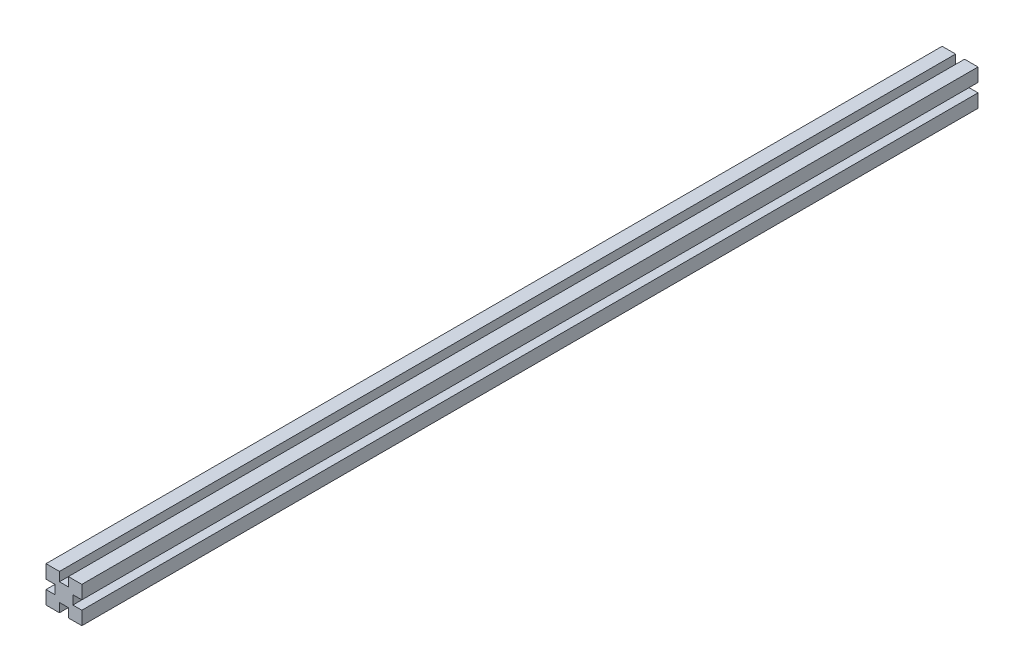
ISO-10303-21;
HEADER;
FILE_DESCRIPTION(('STEP AP214'),'2;1');
FILE_NAME('part.step','',(''),(''),'','','');
FILE_SCHEMA(('AUTOMOTIVE_DESIGN { 1 0 10303 214 1 1 1 1 }'));
ENDSEC;
DATA;
#1=APPLICATION_CONTEXT('core data for automotive mechanical design processes');
#2=APPLICATION_PROTOCOL_DEFINITION('international standard','automotive_design',2000,#1);
#3=PRODUCT_CONTEXT('',#1,'mechanical');
#4=PRODUCT('Part','Part','',(#3));
#5=PRODUCT_RELATED_PRODUCT_CATEGORY('part','',(#4));
#6=PRODUCT_DEFINITION_FORMATION('','',#4);
#7=PRODUCT_DEFINITION_CONTEXT('part definition',#1,'design');
#8=PRODUCT_DEFINITION('design','',#6,#7);
#9=PRODUCT_DEFINITION_SHAPE('','',#8);
#10=(LENGTH_UNIT() NAMED_UNIT(*) SI_UNIT(.MILLI.,.METRE.));
#11=(NAMED_UNIT(*) PLANE_ANGLE_UNIT() SI_UNIT($,.RADIAN.));
#12=(NAMED_UNIT(*) SI_UNIT($,.STERADIAN.) SOLID_ANGLE_UNIT());
#13=UNCERTAINTY_MEASURE_WITH_UNIT(LENGTH_MEASURE(1.E-05),#10,'distance_accuracy_value','');
#14=(GEOMETRIC_REPRESENTATION_CONTEXT(3) GLOBAL_UNCERTAINTY_ASSIGNED_CONTEXT((#13)) GLOBAL_UNIT_ASSIGNED_CONTEXT((#10,
#11,#12)) REPRESENTATION_CONTEXT('',''));
#15=CARTESIAN_POINT('',(0.,0.,0.));
#16=DIRECTION('',(0.,0.,1.));
#17=DIRECTION('',(1.,0.,0.));
#18=AXIS2_PLACEMENT_3D('',#15,#16,#17);
#19=CARTESIAN_POINT('',(10.,2.49999999999997,500.));
#20=DIRECTION('',(-1.,0.,0.));
#21=DIRECTION('',(0.,-1.,0.));
#22=AXIS2_PLACEMENT_3D('',#19,#20,#21);
#23=PLANE('',#22);
#24=DIRECTION('',(0.,1.,0.));
#25=VECTOR('',#24,1.);
#26=CARTESIAN_POINT('',(10.,2.49999999999997,0.));
#27=LINE('',#26,#25);
#28=CARTESIAN_POINT('',(10.,2.49999999999997,0.));
#29=VERTEX_POINT('',#28);
#30=CARTESIAN_POINT('',(10.,10.,0.));
#31=VERTEX_POINT('',#30);
#32=EDGE_CURVE('E203',#29,#31,#27,.T.);
#33=ORIENTED_EDGE('',*,*,#32,.T.);
#34=DIRECTION('',(0.,0.,-1.));
#35=VECTOR('',#34,1.);
#36=CARTESIAN_POINT('',(10.,10.,500.));
#37=LINE('',#36,#35);
#38=CARTESIAN_POINT('',(10.,10.,500.));
#39=VERTEX_POINT('',#38);
#40=EDGE_CURVE('E11',#39,#31,#37,.T.);
#41=ORIENTED_EDGE('',*,*,#40,.F.);
#42=DIRECTION('',(0.,1.,0.));
#43=VECTOR('',#42,1.);
#44=CARTESIAN_POINT('',(10.,2.49999999999997,500.));
#45=LINE('',#44,#43);
#46=CARTESIAN_POINT('',(10.,2.49999999999997,500.));
#47=VERTEX_POINT('',#46);
#48=EDGE_CURVE('E241',#47,#39,#45,.T.);
#49=ORIENTED_EDGE('',*,*,#48,.F.);
#50=DIRECTION('',(0.,0.,-1.));
#51=VECTOR('',#50,1.);
#52=CARTESIAN_POINT('',(10.,2.49999999999997,500.));
#53=LINE('',#52,#51);
#54=EDGE_CURVE('E199',#47,#29,#53,.T.);
#55=ORIENTED_EDGE('',*,*,#54,.T.);
#56=EDGE_LOOP('',(#33,#41,#49,#55));
#57=FACE_BOUND('',#56,.T.);
#58=ADVANCED_FACE('F35',(#57),#23,.F.);
#59=CARTESIAN_POINT('',(2.5,10.,500.));
#60=DIRECTION('',(0.,-1.,0.));
#61=DIRECTION('',(0.,0.,-1.));
#62=AXIS2_PLACEMENT_3D('',#59,#60,#61);
#63=PLANE('',#62);
#64=DIRECTION('',(-1.,0.,0.));
#65=VECTOR('',#64,1.);
#66=CARTESIAN_POINT('',(2.5,10.,0.));
#67=LINE('',#66,#65);
#68=CARTESIAN_POINT('',(2.5,10.,0.));
#69=VERTEX_POINT('',#68);
#70=EDGE_CURVE('E206',#31,#69,#67,.T.);
#71=ORIENTED_EDGE('',*,*,#70,.T.);
#72=DIRECTION('',(0.,0.,-1.));
#73=VECTOR('',#72,1.);
#74=CARTESIAN_POINT('',(2.5,10.,500.));
#75=LINE('',#74,#73);
#76=CARTESIAN_POINT('',(2.5,10.,500.));
#77=VERTEX_POINT('',#76);
#78=EDGE_CURVE('E43',#77,#69,#75,.T.);
#79=ORIENTED_EDGE('',*,*,#78,.F.);
#80=DIRECTION('',(-1.,0.,0.));
#81=VECTOR('',#80,1.);
#82=CARTESIAN_POINT('',(2.5,10.,500.));
#83=LINE('',#82,#81);
#84=EDGE_CURVE('E130',#39,#77,#83,.T.);
#85=ORIENTED_EDGE('',*,*,#84,.F.);
#86=ORIENTED_EDGE('',*,*,#40,.T.);
#87=EDGE_LOOP('',(#71,#79,#85,#86));
#88=FACE_BOUND('',#87,.T.);
#89=ADVANCED_FACE('F359',(#88),#63,.F.);
#90=CARTESIAN_POINT('',(2.5,10.,500.));
#91=DIRECTION('',(1.,0.,0.));
#92=DIRECTION('',(0.,1.,0.));
#93=AXIS2_PLACEMENT_3D('',#90,#91,#92);
#94=PLANE('',#93);
#95=DIRECTION('',(0.,-1.,0.));
#96=VECTOR('',#95,1.);
#97=CARTESIAN_POINT('',(2.5,10.,0.));
#98=LINE('',#97,#96);
#99=CARTESIAN_POINT('',(2.5,5.,0.));
#100=VERTEX_POINT('',#99);
#101=EDGE_CURVE('E208',#69,#100,#98,.T.);
#102=ORIENTED_EDGE('',*,*,#101,.T.);
#103=DIRECTION('',(0.,0.,-1.));
#104=VECTOR('',#103,1.);
#105=CARTESIAN_POINT('',(2.5,5.,500.));
#106=LINE('',#105,#104);
#107=CARTESIAN_POINT('',(2.5,5.,500.));
#108=VERTEX_POINT('',#107);
#109=EDGE_CURVE('E284',#108,#100,#106,.T.);
#110=ORIENTED_EDGE('',*,*,#109,.F.);
#111=DIRECTION('',(0.,-1.,0.));
#112=VECTOR('',#111,1.);
#113=CARTESIAN_POINT('',(2.5,10.,500.));
#114=LINE('',#113,#112);
#115=EDGE_CURVE('E292',#77,#108,#114,.T.);
#116=ORIENTED_EDGE('',*,*,#115,.F.);
#117=ORIENTED_EDGE('',*,*,#78,.T.);
#118=EDGE_LOOP('',(#102,#110,#116,#117));
#119=FACE_BOUND('',#118,.T.);
#120=ADVANCED_FACE('F290',(#119),#94,.F.);
#121=CARTESIAN_POINT('',(2.5,5.,500.));
#122=DIRECTION('',(0.,-1.,0.));
#123=DIRECTION('',(1.,0.,0.));
#124=AXIS2_PLACEMENT_3D('',#121,#122,#123);
#125=PLANE('',#124);
#126=DIRECTION('',(-1.,0.,0.));
#127=VECTOR('',#126,1.);
#128=CARTESIAN_POINT('',(2.5,5.,0.));
#129=LINE('',#128,#127);
#130=CARTESIAN_POINT('',(-2.5,5.,0.));
#131=VERTEX_POINT('',#130);
#132=EDGE_CURVE('E210',#100,#131,#129,.T.);
#133=ORIENTED_EDGE('',*,*,#132,.T.);
#134=DIRECTION('',(0.,0.,-1.));
#135=VECTOR('',#134,1.);
#136=CARTESIAN_POINT('',(-2.5,5.,500.));
#137=LINE('',#136,#135);
#138=CARTESIAN_POINT('',(-2.5,5.,500.));
#139=VERTEX_POINT('',#138);
#140=EDGE_CURVE('E281',#139,#131,#137,.T.);
#141=ORIENTED_EDGE('',*,*,#140,.F.);
#142=DIRECTION('',(-1.,0.,0.));
#143=VECTOR('',#142,1.);
#144=CARTESIAN_POINT('',(2.5,5.,500.));
#145=LINE('',#144,#143);
#146=EDGE_CURVE('E310',#108,#139,#145,.T.);
#147=ORIENTED_EDGE('',*,*,#146,.F.);
#148=ORIENTED_EDGE('',*,*,#109,.T.);
#149=EDGE_LOOP('',(#133,#141,#147,#148));
#150=FACE_BOUND('',#149,.T.);
#151=ADVANCED_FACE('F301',(#150),#125,.F.);
#152=CARTESIAN_POINT('',(-2.5,5.,500.));
#153=DIRECTION('',(-1.,0.,0.));
#154=DIRECTION('',(0.,0.,1.));
#155=AXIS2_PLACEMENT_3D('',#152,#153,#154);
#156=PLANE('',#155);
#157=DIRECTION('',(0.,1.,0.));
#158=VECTOR('',#157,1.);
#159=CARTESIAN_POINT('',(-2.5,5.,0.));
#160=LINE('',#159,#158);
#161=CARTESIAN_POINT('',(-2.5,10.,0.));
#162=VERTEX_POINT('',#161);
#163=EDGE_CURVE('E212',#131,#162,#160,.T.);
#164=ORIENTED_EDGE('',*,*,#163,.T.);
#165=DIRECTION('',(0.,0.,-1.));
#166=VECTOR('',#165,1.);
#167=CARTESIAN_POINT('',(-2.5,10.,500.));
#168=LINE('',#167,#166);
#169=CARTESIAN_POINT('',(-2.5,10.,500.));
#170=VERTEX_POINT('',#169);
#171=EDGE_CURVE('E278',#170,#162,#168,.T.);
#172=ORIENTED_EDGE('',*,*,#171,.F.);
#173=DIRECTION('',(0.,1.,0.));
#174=VECTOR('',#173,1.);
#175=CARTESIAN_POINT('',(-2.5,5.,500.));
#176=LINE('',#175,#174);
#177=EDGE_CURVE('E307',#139,#170,#176,.T.);
#178=ORIENTED_EDGE('',*,*,#177,.F.);
#179=ORIENTED_EDGE('',*,*,#140,.T.);
#180=EDGE_LOOP('',(#164,#172,#178,#179));
#181=FACE_BOUND('',#180,.T.);
#182=ADVANCED_FACE('F305',(#181),#156,.F.);
#183=CARTESIAN_POINT('',(-10.,10.,500.));
#184=DIRECTION('',(0.,-1.,0.));
#185=DIRECTION('',(0.,0.,-1.));
#186=AXIS2_PLACEMENT_3D('',#183,#184,#185);
#187=PLANE('',#186);
#188=DIRECTION('',(-1.,0.,0.));
#189=VECTOR('',#188,1.);
#190=CARTESIAN_POINT('',(-10.,10.,0.));
#191=LINE('',#190,#189);
#192=CARTESIAN_POINT('',(-10.,10.,0.));
#193=VERTEX_POINT('',#192);
#194=EDGE_CURVE('E214',#162,#193,#191,.T.);
#195=ORIENTED_EDGE('',*,*,#194,.T.);
#196=DIRECTION('',(0.,0.,-1.));
#197=VECTOR('',#196,1.);
#198=CARTESIAN_POINT('',(-10.,10.,500.));
#199=LINE('',#198,#197);
#200=CARTESIAN_POINT('',(-10.,10.,500.));
#201=VERTEX_POINT('',#200);
#202=EDGE_CURVE('E275',#201,#193,#199,.T.);
#203=ORIENTED_EDGE('',*,*,#202,.F.);
#204=DIRECTION('',(-1.,0.,0.));
#205=VECTOR('',#204,1.);
#206=CARTESIAN_POINT('',(-10.,10.,500.));
#207=LINE('',#206,#205);
#208=EDGE_CURVE('E309',#170,#201,#207,.T.);
#209=ORIENTED_EDGE('',*,*,#208,.F.);
#210=ORIENTED_EDGE('',*,*,#171,.T.);
#211=EDGE_LOOP('',(#195,#203,#209,#210));
#212=FACE_BOUND('',#211,.T.);
#213=ADVANCED_FACE('F372',(#212),#187,.F.);
#214=CARTESIAN_POINT('',(-9.99999999999997,2.5000000000001,500.));
#215=DIRECTION('',(1.,0.,0.));
#216=DIRECTION('',(0.,1.,0.));
#217=AXIS2_PLACEMENT_3D('',#214,#215,#216);
#218=PLANE('',#217);
#219=DIRECTION('',(0.,-1.,0.));
#220=VECTOR('',#219,1.);
#221=CARTESIAN_POINT('',(-9.99999999999997,2.5000000000001,0.));
#222=LINE('',#221,#220);
#223=CARTESIAN_POINT('',(-9.99999999999997,2.5000000000001,0.));
#224=VERTEX_POINT('',#223);
#225=EDGE_CURVE('E216',#193,#224,#222,.T.);
#226=ORIENTED_EDGE('',*,*,#225,.T.);
#227=DIRECTION('',(0.,0.,-1.));
#228=VECTOR('',#227,1.);
#229=CARTESIAN_POINT('',(-9.99999999999997,2.5000000000001,500.));
#230=LINE('',#229,#228);
#231=CARTESIAN_POINT('',(-9.99999999999997,2.5000000000001,500.));
#232=VERTEX_POINT('',#231);
#233=EDGE_CURVE('E272',#232,#224,#230,.T.);
#234=ORIENTED_EDGE('',*,*,#233,.F.);
#235=DIRECTION('',(0.,-1.,0.));
#236=VECTOR('',#235,1.);
#237=CARTESIAN_POINT('',(-9.99999999999997,2.5000000000001,500.));
#238=LINE('',#237,#236);
#239=EDGE_CURVE('E312',#201,#232,#238,.T.);
#240=ORIENTED_EDGE('',*,*,#239,.F.);
#241=ORIENTED_EDGE('',*,*,#202,.T.);
#242=EDGE_LOOP('',(#226,#234,#240,#241));
#243=FACE_BOUND('',#242,.T.);
#244=ADVANCED_FACE('F375',(#243),#218,.F.);
#245=CARTESIAN_POINT('',(-9.99999999999997,2.5000000000001,500.));
#246=DIRECTION('',(0.,1.,0.));
#247=DIRECTION('',(-1.,0.,0.));
#248=AXIS2_PLACEMENT_3D('',#245,#246,#247);
#249=PLANE('',#248);
#250=DIRECTION('',(1.,0.,0.));
#251=VECTOR('',#250,1.);
#252=CARTESIAN_POINT('',(-9.99999999999997,2.5000000000001,0.));
#253=LINE('',#252,#251);
#254=CARTESIAN_POINT('',(-4.99999999999997,2.50000000000005,0.));
#255=VERTEX_POINT('',#254);
#256=EDGE_CURVE('E218',#224,#255,#253,.T.);
#257=ORIENTED_EDGE('',*,*,#256,.T.);
#258=DIRECTION('',(0.,0.,-1.));
#259=VECTOR('',#258,1.);
#260=CARTESIAN_POINT('',(-4.99999999999997,2.50000000000005,500.));
#261=LINE('',#260,#259);
#262=CARTESIAN_POINT('',(-4.99999999999997,2.50000000000005,500.));
#263=VERTEX_POINT('',#262);
#264=EDGE_CURVE('E269',#263,#255,#261,.T.);
#265=ORIENTED_EDGE('',*,*,#264,.F.);
#266=DIRECTION('',(1.,0.,0.));
#267=VECTOR('',#266,1.);
#268=CARTESIAN_POINT('',(-9.99999999999997,2.5000000000001,500.));
#269=LINE('',#268,#267);
#270=EDGE_CURVE('E318',#232,#263,#269,.T.);
#271=ORIENTED_EDGE('',*,*,#270,.F.);
#272=ORIENTED_EDGE('',*,*,#233,.T.);
#273=EDGE_LOOP('',(#257,#265,#271,#272));
#274=FACE_BOUND('',#273,.T.);
#275=ADVANCED_FACE('F379',(#274),#249,.F.);
#276=CARTESIAN_POINT('',(-4.99999999999997,2.50000000000005,500.));
#277=DIRECTION('',(1.,0.,0.));
#278=DIRECTION('',(0.,1.,0.));
#279=AXIS2_PLACEMENT_3D('',#276,#277,#278);
#280=PLANE('',#279);
#281=DIRECTION('',(0.,-1.,0.));
#282=VECTOR('',#281,1.);
#283=CARTESIAN_POINT('',(-4.99999999999997,2.50000000000005,0.));
#284=LINE('',#283,#282);
#285=CARTESIAN_POINT('',(-5.00000000000002,-2.49999999999995,0.));
#286=VERTEX_POINT('',#285);
#287=EDGE_CURVE('E220',#255,#286,#284,.T.);
#288=ORIENTED_EDGE('',*,*,#287,.T.);
#289=DIRECTION('',(0.,0.,-1.));
#290=VECTOR('',#289,1.);
#291=CARTESIAN_POINT('',(-5.00000000000002,-2.49999999999995,500.));
#292=LINE('',#291,#290);
#293=CARTESIAN_POINT('',(-5.00000000000002,-2.49999999999995,500.));
#294=VERTEX_POINT('',#293);
#295=EDGE_CURVE('E266',#294,#286,#292,.T.);
#296=ORIENTED_EDGE('',*,*,#295,.F.);
#297=DIRECTION('',(0.,-1.,0.));
#298=VECTOR('',#297,1.);
#299=CARTESIAN_POINT('',(-4.99999999999997,2.50000000000005,500.));
#300=LINE('',#299,#298);
#301=EDGE_CURVE('E320',#263,#294,#300,.T.);
#302=ORIENTED_EDGE('',*,*,#301,.F.);
#303=ORIENTED_EDGE('',*,*,#264,.T.);
#304=EDGE_LOOP('',(#288,#296,#302,#303));
#305=FACE_BOUND('',#304,.T.);
#306=ADVANCED_FACE('F383',(#305),#280,.F.);
#307=CARTESIAN_POINT('',(-5.00000000000002,-2.49999999999995,500.));
#308=DIRECTION('',(0.,-1.,0.));
#309=DIRECTION('',(1.,0.,0.));
#310=AXIS2_PLACEMENT_3D('',#307,#308,#309);
#311=PLANE('',#310);
#312=DIRECTION('',(-1.,0.,0.));
#313=VECTOR('',#312,1.);
#314=CARTESIAN_POINT('',(-5.00000000000002,-2.49999999999995,0.));
#315=LINE('',#314,#313);
#316=CARTESIAN_POINT('',(-10.,-2.4999999999999,0.));
#317=VERTEX_POINT('',#316);
#318=EDGE_CURVE('E222',#286,#317,#315,.T.);
#319=ORIENTED_EDGE('',*,*,#318,.T.);
#320=DIRECTION('',(0.,0.,-1.));
#321=VECTOR('',#320,1.);
#322=CARTESIAN_POINT('',(-10.,-2.4999999999999,500.));
#323=LINE('',#322,#321);
#324=CARTESIAN_POINT('',(-10.,-2.4999999999999,500.));
#325=VERTEX_POINT('',#324);
#326=EDGE_CURVE('E263',#325,#317,#323,.T.);
#327=ORIENTED_EDGE('',*,*,#326,.F.);
#328=DIRECTION('',(-1.,0.,0.));
#329=VECTOR('',#328,1.);
#330=CARTESIAN_POINT('',(-5.00000000000002,-2.49999999999995,500.));
#331=LINE('',#330,#329);
#332=EDGE_CURVE('E322',#294,#325,#331,.T.);
#333=ORIENTED_EDGE('',*,*,#332,.F.);
#334=ORIENTED_EDGE('',*,*,#295,.T.);
#335=EDGE_LOOP('',(#319,#327,#333,#334));
#336=FACE_BOUND('',#335,.T.);
#337=ADVANCED_FACE('F387',(#336),#311,.F.);
#338=CARTESIAN_POINT('',(-10.,-10.,500.));
#339=DIRECTION('',(1.,0.,0.));
#340=DIRECTION('',(0.,1.,0.));
#341=AXIS2_PLACEMENT_3D('',#338,#339,#340);
#342=PLANE('',#341);
#343=DIRECTION('',(0.,-1.,0.));
#344=VECTOR('',#343,1.);
#345=CARTESIAN_POINT('',(-10.,-10.,0.));
#346=LINE('',#345,#344);
#347=CARTESIAN_POINT('',(-10.,-10.,0.));
#348=VERTEX_POINT('',#347);
#349=EDGE_CURVE('E224',#317,#348,#346,.T.);
#350=ORIENTED_EDGE('',*,*,#349,.T.);
#351=DIRECTION('',(0.,0.,-1.));
#352=VECTOR('',#351,1.);
#353=CARTESIAN_POINT('',(-10.,-10.,500.));
#354=LINE('',#353,#352);
#355=CARTESIAN_POINT('',(-10.,-10.,500.));
#356=VERTEX_POINT('',#355);
#357=EDGE_CURVE('E260',#356,#348,#354,.T.);
#358=ORIENTED_EDGE('',*,*,#357,.F.);
#359=DIRECTION('',(0.,-1.,0.));
#360=VECTOR('',#359,1.);
#361=CARTESIAN_POINT('',(-10.,-10.,500.));
#362=LINE('',#361,#360);
#363=EDGE_CURVE('E324',#325,#356,#362,.T.);
#364=ORIENTED_EDGE('',*,*,#363,.F.);
#365=ORIENTED_EDGE('',*,*,#326,.T.);
#366=EDGE_LOOP('',(#350,#358,#364,#365));
#367=FACE_BOUND('',#366,.T.);
#368=ADVANCED_FACE('F391',(#367),#342,.F.);
#369=CARTESIAN_POINT('',(-10.,-10.,500.));
#370=DIRECTION('',(0.,1.,0.));
#371=DIRECTION('',(-1.,0.,0.));
#372=AXIS2_PLACEMENT_3D('',#369,#370,#371);
#373=PLANE('',#372);
#374=DIRECTION('',(1.,0.,0.));
#375=VECTOR('',#374,1.);
#376=CARTESIAN_POINT('',(-10.,-10.,0.));
#377=LINE('',#376,#375);
#378=CARTESIAN_POINT('',(-2.50000000000007,-9.99999999999998,0.));
#379=VERTEX_POINT('',#378);
#380=EDGE_CURVE('E226',#348,#379,#377,.T.);
#381=ORIENTED_EDGE('',*,*,#380,.T.);
#382=DIRECTION('',(0.,0.,-1.));
#383=VECTOR('',#382,1.);
#384=CARTESIAN_POINT('',(-2.50000000000007,-9.99999999999998,500.));
#385=LINE('',#384,#383);
#386=CARTESIAN_POINT('',(-2.50000000000007,-9.99999999999998,500.));
#387=VERTEX_POINT('',#386);
#388=EDGE_CURVE('E257',#387,#379,#385,.T.);
#389=ORIENTED_EDGE('',*,*,#388,.F.);
#390=DIRECTION('',(1.,0.,0.));
#391=VECTOR('',#390,1.);
#392=CARTESIAN_POINT('',(-10.,-10.,500.));
#393=LINE('',#392,#391);
#394=EDGE_CURVE('E326',#356,#387,#393,.T.);
#395=ORIENTED_EDGE('',*,*,#394,.F.);
#396=ORIENTED_EDGE('',*,*,#357,.T.);
#397=EDGE_LOOP('',(#381,#389,#395,#396));
#398=FACE_BOUND('',#397,.T.);
#399=ADVANCED_FACE('F395',(#398),#373,.F.);
#400=CARTESIAN_POINT('',(-2.50000000000007,-9.99999999999998,500.));
#401=DIRECTION('',(-1.,0.,0.));
#402=DIRECTION('',(0.,-1.,0.));
#403=AXIS2_PLACEMENT_3D('',#400,#401,#402);
#404=PLANE('',#403);
#405=DIRECTION('',(0.,1.,0.));
#406=VECTOR('',#405,1.);
#407=CARTESIAN_POINT('',(-2.50000000000007,-9.99999999999998,0.));
#408=LINE('',#407,#406);
#409=CARTESIAN_POINT('',(-2.50000000000003,-4.99999999999998,0.));
#410=VERTEX_POINT('',#409);
#411=EDGE_CURVE('E228',#379,#410,#408,.T.);
#412=ORIENTED_EDGE('',*,*,#411,.T.);
#413=DIRECTION('',(0.,0.,-1.));
#414=VECTOR('',#413,1.);
#415=CARTESIAN_POINT('',(-2.50000000000003,-4.99999999999998,500.));
#416=LINE('',#415,#414);
#417=CARTESIAN_POINT('',(-2.50000000000003,-4.99999999999998,500.));
#418=VERTEX_POINT('',#417);
#419=EDGE_CURVE('E254',#418,#410,#416,.T.);
#420=ORIENTED_EDGE('',*,*,#419,.F.);
#421=DIRECTION('',(0.,1.,0.));
#422=VECTOR('',#421,1.);
#423=CARTESIAN_POINT('',(-2.50000000000007,-9.99999999999998,500.));
#424=LINE('',#423,#422);
#425=EDGE_CURVE('E328',#387,#418,#424,.T.);
#426=ORIENTED_EDGE('',*,*,#425,.F.);
#427=ORIENTED_EDGE('',*,*,#388,.T.);
#428=EDGE_LOOP('',(#412,#420,#426,#427));
#429=FACE_BOUND('',#428,.T.);
#430=ADVANCED_FACE('F399',(#429),#404,.F.);
#431=CARTESIAN_POINT('',(-2.50000000000003,-4.99999999999998,500.));
#432=DIRECTION('',(0.,1.,0.));
#433=DIRECTION('',(-1.,0.,0.));
#434=AXIS2_PLACEMENT_3D('',#431,#432,#433);
#435=PLANE('',#434);
#436=DIRECTION('',(1.,0.,0.));
#437=VECTOR('',#436,1.);
#438=CARTESIAN_POINT('',(-2.50000000000003,-4.99999999999998,0.));
#439=LINE('',#438,#437);
#440=CARTESIAN_POINT('',(2.49999999999997,-5.00000000000001,0.));
#441=VERTEX_POINT('',#440);
#442=EDGE_CURVE('E230',#410,#441,#439,.T.);
#443=ORIENTED_EDGE('',*,*,#442,.T.);
#444=DIRECTION('',(0.,0.,-1.));
#445=VECTOR('',#444,1.);
#446=CARTESIAN_POINT('',(2.49999999999997,-5.00000000000001,500.));
#447=LINE('',#446,#445);
#448=CARTESIAN_POINT('',(2.49999999999997,-5.00000000000001,500.));
#449=VERTEX_POINT('',#448);
#450=EDGE_CURVE('E251',#449,#441,#447,.T.);
#451=ORIENTED_EDGE('',*,*,#450,.F.);
#452=DIRECTION('',(1.,0.,0.));
#453=VECTOR('',#452,1.);
#454=CARTESIAN_POINT('',(-2.50000000000003,-4.99999999999998,500.));
#455=LINE('',#454,#453);
#456=EDGE_CURVE('E330',#418,#449,#455,.T.);
#457=ORIENTED_EDGE('',*,*,#456,.F.);
#458=ORIENTED_EDGE('',*,*,#419,.T.);
#459=EDGE_LOOP('',(#443,#451,#457,#458));
#460=FACE_BOUND('',#459,.T.);
#461=ADVANCED_FACE('F403',(#460),#435,.F.);
#462=CARTESIAN_POINT('',(2.49999999999997,-5.00000000000001,500.));
#463=DIRECTION('',(1.,0.,0.));
#464=DIRECTION('',(0.,1.,0.));
#465=AXIS2_PLACEMENT_3D('',#462,#463,#464);
#466=PLANE('',#465);
#467=DIRECTION('',(0.,-1.,0.));
#468=VECTOR('',#467,1.);
#469=CARTESIAN_POINT('',(2.49999999999997,-5.00000000000001,0.));
#470=LINE('',#469,#468);
#471=CARTESIAN_POINT('',(2.49999999999993,-10.,0.));
#472=VERTEX_POINT('',#471);
#473=EDGE_CURVE('E232',#441,#472,#470,.T.);
#474=ORIENTED_EDGE('',*,*,#473,.T.);
#475=DIRECTION('',(0.,0.,-1.));
#476=VECTOR('',#475,1.);
#477=CARTESIAN_POINT('',(2.49999999999993,-10.,500.));
#478=LINE('',#477,#476);
#479=CARTESIAN_POINT('',(2.49999999999993,-10.,500.));
#480=VERTEX_POINT('',#479);
#481=EDGE_CURVE('E248',#480,#472,#478,.T.);
#482=ORIENTED_EDGE('',*,*,#481,.F.);
#483=DIRECTION('',(0.,-1.,0.));
#484=VECTOR('',#483,1.);
#485=CARTESIAN_POINT('',(2.49999999999997,-5.00000000000001,500.));
#486=LINE('',#485,#484);
#487=EDGE_CURVE('E332',#449,#480,#486,.T.);
#488=ORIENTED_EDGE('',*,*,#487,.F.);
#489=ORIENTED_EDGE('',*,*,#450,.T.);
#490=EDGE_LOOP('',(#474,#482,#488,#489));
#491=FACE_BOUND('',#490,.T.);
#492=ADVANCED_FACE('F407',(#491),#466,.F.);
#493=CARTESIAN_POINT('',(2.49999999999993,-10.,500.));
#494=DIRECTION('',(0.,1.,0.));
#495=DIRECTION('',(-1.,0.,0.));
#496=AXIS2_PLACEMENT_3D('',#493,#494,#495);
#497=PLANE('',#496);
#498=DIRECTION('',(1.,0.,0.));
#499=VECTOR('',#498,1.);
#500=CARTESIAN_POINT('',(2.49999999999993,-10.,0.));
#501=LINE('',#500,#499);
#502=CARTESIAN_POINT('',(10.,-10.,0.));
#503=VERTEX_POINT('',#502);
#504=EDGE_CURVE('E234',#472,#503,#501,.T.);
#505=ORIENTED_EDGE('',*,*,#504,.T.);
#506=DIRECTION('',(0.,0.,-1.));
#507=VECTOR('',#506,1.);
#508=CARTESIAN_POINT('',(10.,-10.,500.));
#509=LINE('',#508,#507);
#510=CARTESIAN_POINT('',(10.,-10.,500.));
#511=VERTEX_POINT('',#510);
#512=EDGE_CURVE('E245',#511,#503,#509,.T.);
#513=ORIENTED_EDGE('',*,*,#512,.F.);
#514=DIRECTION('',(1.,0.,0.));
#515=VECTOR('',#514,1.);
#516=CARTESIAN_POINT('',(2.49999999999993,-10.,500.));
#517=LINE('',#516,#515);
#518=EDGE_CURVE('E334',#480,#511,#517,.T.);
#519=ORIENTED_EDGE('',*,*,#518,.F.);
#520=ORIENTED_EDGE('',*,*,#481,.T.);
#521=EDGE_LOOP('',(#505,#513,#519,#520));
#522=FACE_BOUND('',#521,.T.);
#523=ADVANCED_FACE('F340',(#522),#497,.F.);
#524=CARTESIAN_POINT('',(10.,-10.,500.));
#525=DIRECTION('',(-1.,0.,0.));
#526=DIRECTION('',(0.,-1.,0.));
#527=AXIS2_PLACEMENT_3D('',#524,#525,#526);
#528=PLANE('',#527);
#529=DIRECTION('',(0.,1.,0.));
#530=VECTOR('',#529,1.);
#531=CARTESIAN_POINT('',(10.,-10.,0.));
#532=LINE('',#531,#530);
#533=CARTESIAN_POINT('',(9.99999999999999,-2.50000000000003,0.));
#534=VERTEX_POINT('',#533);
#535=EDGE_CURVE('E236',#503,#534,#532,.T.);
#536=ORIENTED_EDGE('',*,*,#535,.T.);
#537=DIRECTION('',(0.,0.,-1.));
#538=VECTOR('',#537,1.);
#539=CARTESIAN_POINT('',(9.99999999999999,-2.50000000000003,500.));
#540=LINE('',#539,#538);
#541=CARTESIAN_POINT('',(9.99999999999999,-2.50000000000003,500.));
#542=VERTEX_POINT('',#541);
#543=EDGE_CURVE('E194',#542,#534,#540,.T.);
#544=ORIENTED_EDGE('',*,*,#543,.F.);
#545=DIRECTION('',(0.,1.,0.));
#546=VECTOR('',#545,1.);
#547=CARTESIAN_POINT('',(10.,-10.,500.));
#548=LINE('',#547,#546);
#549=EDGE_CURVE('E185',#511,#542,#548,.T.);
#550=ORIENTED_EDGE('',*,*,#549,.F.);
#551=ORIENTED_EDGE('',*,*,#512,.T.);
#552=EDGE_LOOP('',(#536,#544,#550,#551));
#553=FACE_BOUND('',#552,.T.);
#554=ADVANCED_FACE('F344',(#553),#528,.F.);
#555=CARTESIAN_POINT('',(9.99999999999999,-2.50000000000003,500.));
#556=DIRECTION('',(0.,-1.,0.));
#557=DIRECTION('',(1.,0.,0.));
#558=AXIS2_PLACEMENT_3D('',#555,#556,#557);
#559=PLANE('',#558);
#560=DIRECTION('',(-1.,0.,0.));
#561=VECTOR('',#560,1.);
#562=CARTESIAN_POINT('',(9.99999999999999,-2.50000000000003,0.));
#563=LINE('',#562,#561);
#564=CARTESIAN_POINT('',(4.99999999999999,-2.50000000000001,0.));
#565=VERTEX_POINT('',#564);
#566=EDGE_CURVE('E193',#534,#565,#563,.T.);
#567=ORIENTED_EDGE('',*,*,#566,.T.);
#568=DIRECTION('',(0.,0.,-1.));
#569=VECTOR('',#568,1.);
#570=CARTESIAN_POINT('',(4.99999999999999,-2.50000000000001,500.));
#571=LINE('',#570,#569);
#572=CARTESIAN_POINT('',(4.99999999999999,-2.50000000000001,500.));
#573=VERTEX_POINT('',#572);
#574=EDGE_CURVE('E190',#573,#565,#571,.T.);
#575=ORIENTED_EDGE('',*,*,#574,.F.);
#576=DIRECTION('',(-1.,0.,0.));
#577=VECTOR('',#576,1.);
#578=CARTESIAN_POINT('',(9.99999999999999,-2.50000000000003,500.));
#579=LINE('',#578,#577);
#580=EDGE_CURVE('E179',#542,#573,#579,.T.);
#581=ORIENTED_EDGE('',*,*,#580,.F.);
#582=ORIENTED_EDGE('',*,*,#543,.T.);
#583=EDGE_LOOP('',(#567,#575,#581,#582));
#584=FACE_BOUND('',#583,.T.);
#585=ADVANCED_FACE('F191',(#584),#559,.F.);
#586=CARTESIAN_POINT('',(4.99999999999999,-2.50000000000001,500.));
#587=DIRECTION('',(-1.,0.,0.));
#588=DIRECTION('',(0.,-1.,0.));
#589=AXIS2_PLACEMENT_3D('',#586,#587,#588);
#590=PLANE('',#589);
#591=DIRECTION('',(0.,1.,0.));
#592=VECTOR('',#591,1.);
#593=CARTESIAN_POINT('',(4.99999999999999,-2.50000000000001,0.));
#594=LINE('',#593,#592);
#595=CARTESIAN_POINT('',(5.,2.49999999999999,0.));
#596=VERTEX_POINT('',#595);
#597=EDGE_CURVE('E116',#565,#596,#594,.T.);
#598=ORIENTED_EDGE('',*,*,#597,.T.);
#599=DIRECTION('',(0.,0.,-1.));
#600=VECTOR('',#599,1.);
#601=CARTESIAN_POINT('',(5.,2.49999999999999,500.));
#602=LINE('',#601,#600);
#603=CARTESIAN_POINT('',(5.,2.49999999999999,500.));
#604=VERTEX_POINT('',#603);
#605=EDGE_CURVE('E195',#604,#596,#602,.T.);
#606=ORIENTED_EDGE('',*,*,#605,.F.);
#607=DIRECTION('',(0.,1.,0.));
#608=VECTOR('',#607,1.);
#609=CARTESIAN_POINT('',(4.99999999999999,-2.50000000000001,500.));
#610=LINE('',#609,#608);
#611=EDGE_CURVE('E183',#573,#604,#610,.T.);
#612=ORIENTED_EDGE('',*,*,#611,.F.);
#613=ORIENTED_EDGE('',*,*,#574,.T.);
#614=EDGE_LOOP('',(#598,#606,#612,#613));
#615=FACE_BOUND('',#614,.T.);
#616=ADVANCED_FACE('F197',(#615),#590,.F.);
#617=CARTESIAN_POINT('',(5.,2.49999999999999,500.));
#618=DIRECTION('',(0.,1.,0.));
#619=DIRECTION('',(-1.,0.,0.));
#620=AXIS2_PLACEMENT_3D('',#617,#618,#619);
#621=PLANE('',#620);
#622=DIRECTION('',(1.,0.,0.));
#623=VECTOR('',#622,1.);
#624=CARTESIAN_POINT('',(5.,2.49999999999999,0.));
#625=LINE('',#624,#623);
#626=EDGE_CURVE('E122',#596,#29,#625,.T.);
#627=ORIENTED_EDGE('',*,*,#626,.T.);
#628=ORIENTED_EDGE('',*,*,#54,.F.);
#629=DIRECTION('',(1.,0.,0.));
#630=VECTOR('',#629,1.);
#631=CARTESIAN_POINT('',(5.,2.49999999999999,500.));
#632=LINE('',#631,#630);
#633=EDGE_CURVE('E51',#604,#47,#632,.T.);
#634=ORIENTED_EDGE('',*,*,#633,.F.);
#635=ORIENTED_EDGE('',*,*,#605,.T.);
#636=EDGE_LOOP('',(#627,#628,#634,#635));
#637=FACE_BOUND('',#636,.T.);
#638=ADVANCED_FACE('F348',(#637),#621,.F.);
#639=CARTESIAN_POINT('',(0.,0.,500.));
#640=DIRECTION('',(0.,0.,-1.));
#641=DIRECTION('',(-1.,0.,0.));
#642=AXIS2_PLACEMENT_3D('',#639,#640,#641);
#643=PLANE('',#642);
#644=ORIENTED_EDGE('',*,*,#48,.T.);
#645=ORIENTED_EDGE('',*,*,#84,.T.);
#646=ORIENTED_EDGE('',*,*,#115,.T.);
#647=ORIENTED_EDGE('',*,*,#146,.T.);
#648=ORIENTED_EDGE('',*,*,#177,.T.);
#649=ORIENTED_EDGE('',*,*,#208,.T.);
#650=ORIENTED_EDGE('',*,*,#239,.T.);
#651=ORIENTED_EDGE('',*,*,#270,.T.);
#652=ORIENTED_EDGE('',*,*,#301,.T.);
#653=ORIENTED_EDGE('',*,*,#332,.T.);
#654=ORIENTED_EDGE('',*,*,#363,.T.);
#655=ORIENTED_EDGE('',*,*,#394,.T.);
#656=ORIENTED_EDGE('',*,*,#425,.T.);
#657=ORIENTED_EDGE('',*,*,#456,.T.);
#658=ORIENTED_EDGE('',*,*,#487,.T.);
#659=ORIENTED_EDGE('',*,*,#518,.T.);
#660=ORIENTED_EDGE('',*,*,#549,.T.);
#661=ORIENTED_EDGE('',*,*,#580,.T.);
#662=ORIENTED_EDGE('',*,*,#611,.T.);
#663=ORIENTED_EDGE('',*,*,#633,.T.);
#664=EDGE_LOOP('',(#644,#645,#646,#647,#648,#649,#650,#651,#652,#653,#654,#655,#656,#657,#658,
#659,#660,#661,#662,#663));
#665=FACE_BOUND('',#664,.T.);
#666=ADVANCED_FACE('F181',(#665),#643,.F.);
#667=CARTESIAN_POINT('',(0.,0.,0.));
#668=DIRECTION('',(0.,0.,-1.));
#669=DIRECTION('',(-1.,0.,0.));
#670=AXIS2_PLACEMENT_3D('',#667,#668,#669);
#671=PLANE('',#670);
#672=ORIENTED_EDGE('',*,*,#32,.F.);
#673=ORIENTED_EDGE('',*,*,#626,.F.);
#674=ORIENTED_EDGE('',*,*,#597,.F.);
#675=ORIENTED_EDGE('',*,*,#566,.F.);
#676=ORIENTED_EDGE('',*,*,#535,.F.);
#677=ORIENTED_EDGE('',*,*,#504,.F.);
#678=ORIENTED_EDGE('',*,*,#473,.F.);
#679=ORIENTED_EDGE('',*,*,#442,.F.);
#680=ORIENTED_EDGE('',*,*,#411,.F.);
#681=ORIENTED_EDGE('',*,*,#380,.F.);
#682=ORIENTED_EDGE('',*,*,#349,.F.);
#683=ORIENTED_EDGE('',*,*,#318,.F.);
#684=ORIENTED_EDGE('',*,*,#287,.F.);
#685=ORIENTED_EDGE('',*,*,#256,.F.);
#686=ORIENTED_EDGE('',*,*,#225,.F.);
#687=ORIENTED_EDGE('',*,*,#194,.F.);
#688=ORIENTED_EDGE('',*,*,#163,.F.);
#689=ORIENTED_EDGE('',*,*,#132,.F.);
#690=ORIENTED_EDGE('',*,*,#101,.F.);
#691=ORIENTED_EDGE('',*,*,#70,.F.);
#692=EDGE_LOOP('',(#672,#673,#674,#675,#676,#677,#678,#679,#680,#681,#682,#683,#684,#685,#686,
#687,#688,#689,#690,#691));
#693=FACE_BOUND('',#692,.T.);
#694=ADVANCED_FACE('F296',(#693),#671,.T.);
#695=CLOSED_SHELL('',(#58,#89,#120,#151,#182,#213,#244,#275,#306,#337,#368,#399,#430,#461,#492,
#523,#554,#585,#616,#638,#666,#694));
#696=MANIFOLD_SOLID_BREP('B2',#695);
#697=ADVANCED_BREP_SHAPE_REPRESENTATION('',(#18,#696),#14);
#698=SHAPE_DEFINITION_REPRESENTATION(#9,#697);
ENDSEC;
END-ISO-10303-21;
